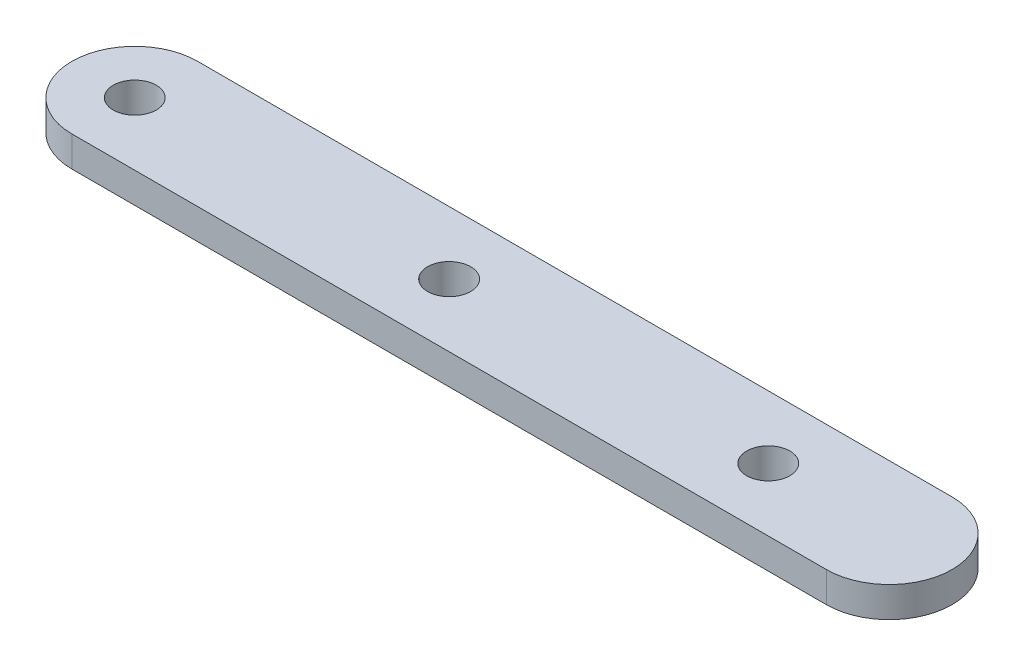
ISO-10303-21;
HEADER;
FILE_DESCRIPTION(('STEP AP214'),'2;1');
FILE_NAME('part.step','',(''),(''),'','','');
FILE_SCHEMA(('AUTOMOTIVE_DESIGN { 1 0 10303 214 1 1 1 1 }'));
ENDSEC;
DATA;
#1=APPLICATION_CONTEXT('core data for automotive mechanical design processes');
#2=APPLICATION_PROTOCOL_DEFINITION('international standard','automotive_design',2000,#1);
#3=PRODUCT_CONTEXT('',#1,'mechanical');
#4=PRODUCT('Part','Part','',(#3));
#5=PRODUCT_RELATED_PRODUCT_CATEGORY('part','',(#4));
#6=PRODUCT_DEFINITION_FORMATION('','',#4);
#7=PRODUCT_DEFINITION_CONTEXT('part definition',#1,'design');
#8=PRODUCT_DEFINITION('design','',#6,#7);
#9=PRODUCT_DEFINITION_SHAPE('','',#8);
#10=(LENGTH_UNIT() NAMED_UNIT(*) SI_UNIT(.MILLI.,.METRE.));
#11=(NAMED_UNIT(*) PLANE_ANGLE_UNIT() SI_UNIT($,.RADIAN.));
#12=(NAMED_UNIT(*) SI_UNIT($,.STERADIAN.) SOLID_ANGLE_UNIT());
#13=UNCERTAINTY_MEASURE_WITH_UNIT(LENGTH_MEASURE(1.E-05),#10,'distance_accuracy_value','');
#14=(GEOMETRIC_REPRESENTATION_CONTEXT(3) GLOBAL_UNCERTAINTY_ASSIGNED_CONTEXT((#13)) GLOBAL_UNIT_ASSIGNED_CONTEXT((#10,
#11,#12)) REPRESENTATION_CONTEXT('',''));
#15=CARTESIAN_POINT('',(0.,0.,0.));
#16=DIRECTION('',(0.,0.,1.));
#17=DIRECTION('',(1.,0.,0.));
#18=AXIS2_PLACEMENT_3D('',#15,#16,#17);
#19=CARTESIAN_POINT('',(-62.8446619217082,3.075,-2.35017793594306));
#20=DIRECTION('',(0.,-1.,0.));
#21=DIRECTION('',(0.,0.,-1.));
#22=AXIS2_PLACEMENT_3D('',#19,#20,#21);
#23=CYLINDRICAL_SURFACE('',#22,6.35);
#24=CARTESIAN_POINT('',(-62.8446619217082,0.,-2.35017793594306));
#25=DIRECTION('',(0.,1.,0.));
#26=DIRECTION('',(0.,0.,1.));
#27=AXIS2_PLACEMENT_3D('',#24,#25,#26);
#28=CIRCLE('',#27,6.35);
#29=CARTESIAN_POINT('',(-62.8446619217082,0.,-8.70017793594306));
#30=VERTEX_POINT('',#29);
#31=CARTESIAN_POINT('',(-62.8446619217082,0.,3.99982206405694));
#32=VERTEX_POINT('',#31);
#33=EDGE_CURVE('E114',#30,#32,#28,.T.);
#34=ORIENTED_EDGE('',*,*,#33,.T.);
#35=DIRECTION('',(0.,-1.,0.));
#36=VECTOR('',#35,1.);
#37=CARTESIAN_POINT('',(-62.8446619217082,3.075,3.99982206405694));
#38=LINE('',#37,#36);
#39=CARTESIAN_POINT('',(-62.8446619217082,3.075,3.99982206405694));
#40=VERTEX_POINT('',#39);
#41=EDGE_CURVE('E11',#40,#32,#38,.T.);
#42=ORIENTED_EDGE('',*,*,#41,.F.);
#43=CARTESIAN_POINT('',(-62.8446619217082,3.075,-2.35017793594306));
#44=DIRECTION('',(0.,1.,0.));
#45=DIRECTION('',(0.,0.,1.));
#46=AXIS2_PLACEMENT_3D('',#43,#44,#45);
#47=CIRCLE('',#46,6.35);
#48=CARTESIAN_POINT('',(-62.8446619217082,3.075,-8.70017793594306));
#49=VERTEX_POINT('',#48);
#50=EDGE_CURVE('E97',#49,#40,#47,.T.);
#51=ORIENTED_EDGE('',*,*,#50,.F.);
#52=DIRECTION('',(0.,-1.,0.));
#53=VECTOR('',#52,1.);
#54=CARTESIAN_POINT('',(-62.8446619217082,3.075,-8.70017793594306));
#55=LINE('',#54,#53);
#56=EDGE_CURVE('E110',#49,#30,#55,.T.);
#57=ORIENTED_EDGE('',*,*,#56,.T.);
#58=EDGE_LOOP('',(#34,#42,#51,#57));
#59=FACE_BOUND('',#58,.T.);
#60=ADVANCED_FACE('F43',(#59),#23,.T.);
#61=CARTESIAN_POINT('',(-62.8446619217082,3.075,3.99982206405694));
#62=DIRECTION('',(0.,0.,-1.));
#63=DIRECTION('',(-1.,0.,0.));
#64=AXIS2_PLACEMENT_3D('',#61,#62,#63);
#65=PLANE('',#64);
#66=DIRECTION('',(1.,0.,0.));
#67=VECTOR('',#66,1.);
#68=CARTESIAN_POINT('',(-62.8446619217082,0.,3.99982206405694));
#69=LINE('',#68,#67);
#70=CARTESIAN_POINT('',(13.3553380782918,0.,3.99982206405694));
#71=VERTEX_POINT('',#70);
#72=EDGE_CURVE('E102',#32,#71,#69,.T.);
#73=ORIENTED_EDGE('',*,*,#72,.T.);
#74=DIRECTION('',(0.,-1.,0.));
#75=VECTOR('',#74,1.);
#76=CARTESIAN_POINT('',(13.3553380782918,3.075,3.99982206405694));
#77=LINE('',#76,#75);
#78=CARTESIAN_POINT('',(13.3553380782918,3.075,3.99982206405694));
#79=VERTEX_POINT('',#78);
#80=EDGE_CURVE('E53',#79,#71,#77,.T.);
#81=ORIENTED_EDGE('',*,*,#80,.F.);
#82=DIRECTION('',(1.,0.,0.));
#83=VECTOR('',#82,1.);
#84=CARTESIAN_POINT('',(-62.8446619217082,3.075,3.99982206405694));
#85=LINE('',#84,#83);
#86=EDGE_CURVE('E92',#40,#79,#85,.T.);
#87=ORIENTED_EDGE('',*,*,#86,.F.);
#88=ORIENTED_EDGE('',*,*,#41,.T.);
#89=EDGE_LOOP('',(#73,#81,#87,#88));
#90=FACE_BOUND('',#89,.T.);
#91=ADVANCED_FACE('F101',(#90),#65,.F.);
#92=CARTESIAN_POINT('',(13.3553380782918,3.075,-2.35017793594306));
#93=DIRECTION('',(0.,-1.,0.));
#94=DIRECTION('',(0.,0.,-1.));
#95=AXIS2_PLACEMENT_3D('',#92,#93,#94);
#96=CYLINDRICAL_SURFACE('',#95,6.35);
#97=CARTESIAN_POINT('',(13.3553380782918,0.,-2.35017793594306));
#98=DIRECTION('',(0.,1.,0.));
#99=DIRECTION('',(0.,0.,-1.));
#100=AXIS2_PLACEMENT_3D('',#97,#98,#99);
#101=CIRCLE('',#100,6.35);
#102=CARTESIAN_POINT('',(13.3553380782918,0.,-8.70017793594306));
#103=VERTEX_POINT('',#102);
#104=EDGE_CURVE('E79',#71,#103,#101,.T.);
#105=ORIENTED_EDGE('',*,*,#104,.T.);
#106=DIRECTION('',(0.,-1.,0.));
#107=VECTOR('',#106,1.);
#108=CARTESIAN_POINT('',(13.3553380782918,3.075,-8.70017793594306));
#109=LINE('',#108,#107);
#110=CARTESIAN_POINT('',(13.3553380782918,3.075,-8.70017793594306));
#111=VERTEX_POINT('',#110);
#112=EDGE_CURVE('E104',#111,#103,#109,.T.);
#113=ORIENTED_EDGE('',*,*,#112,.F.);
#114=CARTESIAN_POINT('',(13.3553380782918,3.075,-2.35017793594306));
#115=DIRECTION('',(0.,1.,0.));
#116=DIRECTION('',(0.,0.,-1.));
#117=AXIS2_PLACEMENT_3D('',#114,#115,#116);
#118=CIRCLE('',#117,6.35);
#119=EDGE_CURVE('E95',#79,#111,#118,.T.);
#120=ORIENTED_EDGE('',*,*,#119,.F.);
#121=ORIENTED_EDGE('',*,*,#80,.T.);
#122=EDGE_LOOP('',(#105,#113,#120,#121));
#123=FACE_BOUND('',#122,.T.);
#124=ADVANCED_FACE('F106',(#123),#96,.T.);
#125=CARTESIAN_POINT('',(-62.8446619217082,3.075,-8.70017793594306));
#126=DIRECTION('',(0.,0.,1.));
#127=DIRECTION('',(1.,0.,0.));
#128=AXIS2_PLACEMENT_3D('',#125,#126,#127);
#129=PLANE('',#128);
#130=DIRECTION('',(-1.,0.,0.));
#131=VECTOR('',#130,1.);
#132=CARTESIAN_POINT('',(-62.8446619217082,0.,-8.70017793594306));
#133=LINE('',#132,#131);
#134=EDGE_CURVE('E85',#103,#30,#133,.T.);
#135=ORIENTED_EDGE('',*,*,#134,.T.);
#136=ORIENTED_EDGE('',*,*,#56,.F.);
#137=DIRECTION('',(-1.,0.,0.));
#138=VECTOR('',#137,1.);
#139=CARTESIAN_POINT('',(-62.8446619217082,3.075,-8.70017793594306));
#140=LINE('',#139,#138);
#141=EDGE_CURVE('E62',#111,#49,#140,.T.);
#142=ORIENTED_EDGE('',*,*,#141,.F.);
#143=ORIENTED_EDGE('',*,*,#112,.T.);
#144=EDGE_LOOP('',(#135,#136,#142,#143));
#145=FACE_BOUND('',#144,.T.);
#146=ADVANCED_FACE('F170',(#145),#129,.F.);
#147=CARTESIAN_POINT('',(-62.8446619217082,3.075,-2.35017793594306));
#148=DIRECTION('',(0.,1.,0.));
#149=DIRECTION('',(0.,0.,1.));
#150=AXIS2_PLACEMENT_3D('',#147,#148,#149);
#151=PLANE('',#150);
#152=CARTESIAN_POINT('',(1.13533807829182,3.075,-2.35017793594306));
#153=DIRECTION('',(0.,1.,0.));
#154=DIRECTION('',(0.,0.,1.));
#155=AXIS2_PLACEMENT_3D('',#152,#153,#154);
#156=CIRCLE('',#155,2.175);
#157=CARTESIAN_POINT('',(1.13533807829182,3.075,-0.175177935943059));
#158=VERTEX_POINT('',#157);
#159=EDGE_CURVE('E245',#158,#158,#156,.T.);
#160=ORIENTED_EDGE('',*,*,#159,.F.);
#161=EDGE_LOOP('',(#160));
#162=FACE_BOUND('',#161,.T.);
#163=CARTESIAN_POINT('',(-62.8446619217082,3.075,-2.35017793594306));
#164=DIRECTION('',(0.,1.,0.));
#165=DIRECTION('',(0.,0.,1.));
#166=AXIS2_PLACEMENT_3D('',#163,#164,#165);
#167=CIRCLE('',#166,2.175);
#168=CARTESIAN_POINT('',(-62.8446619217082,3.075,-0.17517793594306));
#169=VERTEX_POINT('',#168);
#170=EDGE_CURVE('E249',#169,#169,#167,.T.);
#171=ORIENTED_EDGE('',*,*,#170,.F.);
#172=EDGE_LOOP('',(#171));
#173=FACE_BOUND('',#172,.T.);
#174=CARTESIAN_POINT('',(-31.0946619217082,3.075,-2.35017793594306));
#175=DIRECTION('',(0.,1.,0.));
#176=DIRECTION('',(0.,0.,1.));
#177=AXIS2_PLACEMENT_3D('',#174,#175,#176);
#178=CIRCLE('',#177,2.175);
#179=CARTESIAN_POINT('',(-31.0946619217082,3.075,-0.175177935943059));
#180=VERTEX_POINT('',#179);
#181=EDGE_CURVE('E132',#180,#180,#178,.T.);
#182=ORIENTED_EDGE('',*,*,#181,.F.);
#183=EDGE_LOOP('',(#182));
#184=FACE_BOUND('',#183,.T.);
#185=ORIENTED_EDGE('',*,*,#50,.T.);
#186=ORIENTED_EDGE('',*,*,#86,.T.);
#187=ORIENTED_EDGE('',*,*,#119,.T.);
#188=ORIENTED_EDGE('',*,*,#141,.T.);
#189=EDGE_LOOP('',(#185,#186,#187,#188));
#190=FACE_BOUND('',#189,.T.);
#191=ADVANCED_FACE('F93',(#162,#173,#184,#190),#151,.T.);
#192=CARTESIAN_POINT('',(-62.8446619217082,0.,-2.35017793594306));
#193=DIRECTION('',(0.,1.,0.));
#194=DIRECTION('',(0.,0.,1.));
#195=AXIS2_PLACEMENT_3D('',#192,#193,#194);
#196=PLANE('',#195);
#197=CARTESIAN_POINT('',(1.13533807829182,0.,-2.35017793594306));
#198=DIRECTION('',(0.,1.,0.));
#199=DIRECTION('',(0.,0.,1.));
#200=AXIS2_PLACEMENT_3D('',#197,#198,#199);
#201=CIRCLE('',#200,2.175);
#202=CARTESIAN_POINT('',(1.13533807829182,0.,-0.175177935943059));
#203=VERTEX_POINT('',#202);
#204=EDGE_CURVE('E46',#203,#203,#201,.T.);
#205=ORIENTED_EDGE('',*,*,#204,.T.);
#206=EDGE_LOOP('',(#205));
#207=FACE_BOUND('',#206,.T.);
#208=CARTESIAN_POINT('',(-62.8446619217082,0.,-2.35017793594306));
#209=DIRECTION('',(0.,1.,0.));
#210=DIRECTION('',(0.,0.,1.));
#211=AXIS2_PLACEMENT_3D('',#208,#209,#210);
#212=CIRCLE('',#211,2.175);
#213=CARTESIAN_POINT('',(-62.8446619217082,0.,-0.17517793594306));
#214=VERTEX_POINT('',#213);
#215=EDGE_CURVE('E131',#214,#214,#212,.T.);
#216=ORIENTED_EDGE('',*,*,#215,.T.);
#217=EDGE_LOOP('',(#216));
#218=FACE_BOUND('',#217,.T.);
#219=CARTESIAN_POINT('',(-31.0946619217082,0.,-2.35017793594306));
#220=DIRECTION('',(0.,1.,0.));
#221=DIRECTION('',(0.,0.,1.));
#222=AXIS2_PLACEMENT_3D('',#219,#220,#221);
#223=CIRCLE('',#222,2.175);
#224=CARTESIAN_POINT('',(-31.0946619217082,0.,-0.175177935943059));
#225=VERTEX_POINT('',#224);
#226=EDGE_CURVE('E128',#225,#225,#223,.T.);
#227=ORIENTED_EDGE('',*,*,#226,.T.);
#228=EDGE_LOOP('',(#227));
#229=FACE_BOUND('',#228,.T.);
#230=ORIENTED_EDGE('',*,*,#33,.F.);
#231=ORIENTED_EDGE('',*,*,#134,.F.);
#232=ORIENTED_EDGE('',*,*,#104,.F.);
#233=ORIENTED_EDGE('',*,*,#72,.F.);
#234=EDGE_LOOP('',(#230,#231,#232,#233));
#235=FACE_BOUND('',#234,.T.);
#236=ADVANCED_FACE('F141',(#207,#218,#229,#235),#196,.F.);
#237=CARTESIAN_POINT('',(-31.0946619217082,-3.275,-2.35017793594306));
#238=DIRECTION('',(0.,1.,0.));
#239=DIRECTION('',(0.,0.,1.));
#240=AXIS2_PLACEMENT_3D('',#237,#238,#239);
#241=CYLINDRICAL_SURFACE('',#240,2.175);
#242=ORIENTED_EDGE('',*,*,#181,.T.);
#243=EDGE_LOOP('',(#242));
#244=FACE_BOUND('',#243,.T.);
#245=ORIENTED_EDGE('',*,*,#226,.F.);
#246=EDGE_LOOP('',(#245));
#247=FACE_BOUND('',#246,.T.);
#248=ADVANCED_FACE('F151',(#244,#247),#241,.F.);
#249=CARTESIAN_POINT('',(-62.8446619217082,-3.275,-2.35017793594306));
#250=DIRECTION('',(0.,1.,0.));
#251=DIRECTION('',(0.,0.,1.));
#252=AXIS2_PLACEMENT_3D('',#249,#250,#251);
#253=CYLINDRICAL_SURFACE('',#252,2.175);
#254=ORIENTED_EDGE('',*,*,#170,.T.);
#255=EDGE_LOOP('',(#254));
#256=FACE_BOUND('',#255,.T.);
#257=ORIENTED_EDGE('',*,*,#215,.F.);
#258=EDGE_LOOP('',(#257));
#259=FACE_BOUND('',#258,.T.);
#260=ADVANCED_FACE('F145',(#256,#259),#253,.F.);
#261=CARTESIAN_POINT('',(1.13533807829182,-3.275,-2.35017793594306));
#262=DIRECTION('',(0.,1.,0.));
#263=DIRECTION('',(0.,0.,1.));
#264=AXIS2_PLACEMENT_3D('',#261,#262,#263);
#265=CYLINDRICAL_SURFACE('',#264,2.175);
#266=ORIENTED_EDGE('',*,*,#159,.T.);
#267=EDGE_LOOP('',(#266));
#268=FACE_BOUND('',#267,.T.);
#269=ORIENTED_EDGE('',*,*,#204,.F.);
#270=EDGE_LOOP('',(#269));
#271=FACE_BOUND('',#270,.T.);
#272=ADVANCED_FACE('F143',(#268,#271),#265,.F.);
#273=CLOSED_SHELL('',(#60,#91,#124,#146,#191,#236,#248,#260,#272));
#274=MANIFOLD_SOLID_BREP('B2',#273);
#275=ADVANCED_BREP_SHAPE_REPRESENTATION('',(#18,#274),#14);
#276=SHAPE_DEFINITION_REPRESENTATION(#9,#275);
ENDSEC;
END-ISO-10303-21;
